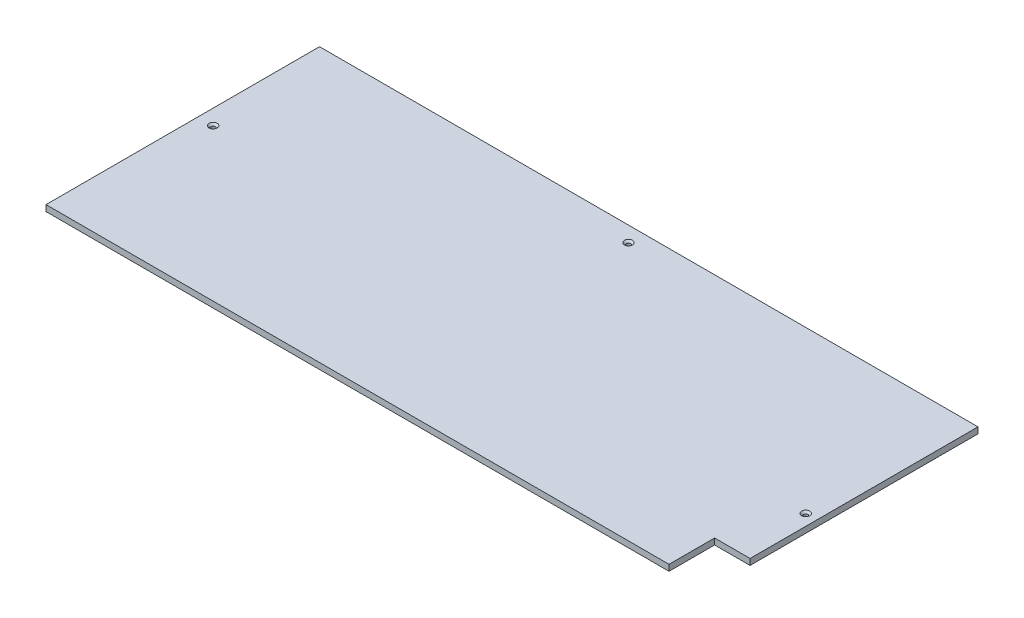
ISO-10303-21;
HEADER;
FILE_DESCRIPTION(('STEP AP214'),'2;1');
FILE_NAME('part.step','',(''),(''),'','','');
FILE_SCHEMA(('AUTOMOTIVE_DESIGN { 1 0 10303 214 1 1 1 1 }'));
ENDSEC;
DATA;
#1=APPLICATION_CONTEXT('core data for automotive mechanical design processes');
#2=APPLICATION_PROTOCOL_DEFINITION('international standard','automotive_design',2000,#1);
#3=PRODUCT_CONTEXT('',#1,'mechanical');
#4=PRODUCT('Part','Part','',(#3));
#5=PRODUCT_RELATED_PRODUCT_CATEGORY('part','',(#4));
#6=PRODUCT_DEFINITION_FORMATION('','',#4);
#7=PRODUCT_DEFINITION_CONTEXT('part definition',#1,'design');
#8=PRODUCT_DEFINITION('design','',#6,#7);
#9=PRODUCT_DEFINITION_SHAPE('','',#8);
#10=(LENGTH_UNIT() NAMED_UNIT(*) SI_UNIT(.MILLI.,.METRE.));
#11=(NAMED_UNIT(*) PLANE_ANGLE_UNIT() SI_UNIT($,.RADIAN.));
#12=(NAMED_UNIT(*) SI_UNIT($,.STERADIAN.) SOLID_ANGLE_UNIT());
#13=UNCERTAINTY_MEASURE_WITH_UNIT(LENGTH_MEASURE(1.E-05),#10,'distance_accuracy_value','');
#14=(GEOMETRIC_REPRESENTATION_CONTEXT(3) GLOBAL_UNCERTAINTY_ASSIGNED_CONTEXT((#13)) GLOBAL_UNIT_ASSIGNED_CONTEXT((#10,
#11,#12)) REPRESENTATION_CONTEXT('',''));
#15=CARTESIAN_POINT('',(0.,0.,0.));
#16=DIRECTION('',(0.,0.,1.));
#17=DIRECTION('',(1.,0.,0.));
#18=AXIS2_PLACEMENT_3D('',#15,#16,#17);
#19=CARTESIAN_POINT('',(325.,6.,150.));
#20=DIRECTION('',(0.,0.,-1.));
#21=DIRECTION('',(-1.,0.,0.));
#22=AXIS2_PLACEMENT_3D('',#19,#20,#21);
#23=PLANE('',#22);
#24=DIRECTION('',(0.,-1.,0.));
#25=VECTOR('',#24,1.);
#26=CARTESIAN_POINT('',(290.,6.,150.));
#27=LINE('',#26,#25);
#28=CARTESIAN_POINT('',(290.,6.,150.));
#29=VERTEX_POINT('',#28);
#30=CARTESIAN_POINT('',(290.,0.,150.));
#31=VERTEX_POINT('',#30);
#32=EDGE_CURVE('E117',#29,#31,#27,.T.);
#33=ORIENTED_EDGE('',*,*,#32,.F.);
#34=DIRECTION('',(1.,0.,0.));
#35=VECTOR('',#34,1.);
#36=CARTESIAN_POINT('',(325.,6.,150.));
#37=LINE('',#36,#35);
#38=CARTESIAN_POINT('',(-325.,6.,150.));
#39=VERTEX_POINT('',#38);
#40=EDGE_CURVE('E81',#39,#29,#37,.T.);
#41=ORIENTED_EDGE('',*,*,#40,.F.);
#42=DIRECTION('',(0.,-1.,0.));
#43=VECTOR('',#42,1.);
#44=CARTESIAN_POINT('',(-325.,6.,150.));
#45=LINE('',#44,#43);
#46=CARTESIAN_POINT('',(-325.,0.,150.));
#47=VERTEX_POINT('',#46);
#48=EDGE_CURVE('E138',#39,#47,#45,.T.);
#49=ORIENTED_EDGE('',*,*,#48,.T.);
#50=DIRECTION('',(1.,0.,0.));
#51=VECTOR('',#50,1.);
#52=CARTESIAN_POINT('',(325.,0.,150.));
#53=LINE('',#52,#51);
#54=EDGE_CURVE('E129',#47,#31,#53,.T.);
#55=ORIENTED_EDGE('',*,*,#54,.T.);
#56=EDGE_LOOP('',(#33,#41,#49,#55));
#57=FACE_BOUND('',#56,.T.);
#58=ADVANCED_FACE('F34',(#57),#23,.F.);
#59=CARTESIAN_POINT('',(0.,6.,0.));
#60=DIRECTION('',(0.,1.,0.));
#61=DIRECTION('',(0.,0.,1.));
#62=AXIS2_PLACEMENT_3D('',#59,#60,#61);
#63=PLANE('',#62);
#64=CARTESIAN_POINT('',(-310.,6.,0.));
#65=DIRECTION('',(0.,1.,0.));
#66=DIRECTION('',(0.,0.,1.));
#67=AXIS2_PLACEMENT_3D('',#64,#65,#66);
#68=CIRCLE('',#67,4.);
#69=CARTESIAN_POINT('',(-310.,6.,3.99999999999993));
#70=VERTEX_POINT('',#69);
#71=EDGE_CURVE('E199',#70,#70,#68,.T.);
#72=ORIENTED_EDGE('',*,*,#71,.F.);
#73=EDGE_LOOP('',(#72));
#74=FACE_BOUND('',#73,.T.);
#75=CARTESIAN_POINT('',(-5.00000000000006,6.,-105.));
#76=DIRECTION('',(0.,1.,0.));
#77=DIRECTION('',(0.,0.,1.));
#78=AXIS2_PLACEMENT_3D('',#75,#76,#77);
#79=CIRCLE('',#78,4.);
#80=CARTESIAN_POINT('',(-5.00000000000006,6.,-101.));
#81=VERTEX_POINT('',#80);
#82=EDGE_CURVE('E206',#81,#81,#79,.T.);
#83=ORIENTED_EDGE('',*,*,#82,.F.);
#84=EDGE_LOOP('',(#83));
#85=FACE_BOUND('',#84,.T.);
#86=CARTESIAN_POINT('',(314.,6.,38.9999999999999));
#87=DIRECTION('',(0.,1.,0.));
#88=DIRECTION('',(0.,0.,1.));
#89=AXIS2_PLACEMENT_3D('',#86,#87,#88);
#90=CIRCLE('',#89,4.);
#91=CARTESIAN_POINT('',(314.,6.,42.9999999999999));
#92=VERTEX_POINT('',#91);
#93=EDGE_CURVE('E215',#92,#92,#90,.T.);
#94=ORIENTED_EDGE('',*,*,#93,.F.);
#95=EDGE_LOOP('',(#94));
#96=FACE_BOUND('',#95,.T.);
#97=ORIENTED_EDGE('',*,*,#40,.T.);
#98=DIRECTION('',(0.,0.,-1.));
#99=VECTOR('',#98,1.);
#100=CARTESIAN_POINT('',(290.,6.,0.));
#101=LINE('',#100,#99);
#102=CARTESIAN_POINT('',(290.,6.,105.));
#103=VERTEX_POINT('',#102);
#104=EDGE_CURVE('E101',#29,#103,#101,.T.);
#105=ORIENTED_EDGE('',*,*,#104,.T.);
#106=DIRECTION('',(-1.,0.,0.));
#107=VECTOR('',#106,1.);
#108=CARTESIAN_POINT('',(0.,6.,105.));
#109=LINE('',#108,#107);
#110=CARTESIAN_POINT('',(325.,6.,105.));
#111=VERTEX_POINT('',#110);
#112=EDGE_CURVE('E95',#111,#103,#109,.T.);
#113=ORIENTED_EDGE('',*,*,#112,.F.);
#114=DIRECTION('',(0.,0.,-1.));
#115=VECTOR('',#114,1.);
#116=CARTESIAN_POINT('',(325.,6.,150.));
#117=LINE('',#116,#115);
#118=CARTESIAN_POINT('',(325.,6.,-120.));
#119=VERTEX_POINT('',#118);
#120=EDGE_CURVE('E123',#111,#119,#117,.T.);
#121=ORIENTED_EDGE('',*,*,#120,.T.);
#122=DIRECTION('',(-1.,0.,0.));
#123=VECTOR('',#122,1.);
#124=CARTESIAN_POINT('',(325.,6.,-120.));
#125=LINE('',#124,#123);
#126=CARTESIAN_POINT('',(-325.,6.,-120.));
#127=VERTEX_POINT('',#126);
#128=EDGE_CURVE('E57',#119,#127,#125,.T.);
#129=ORIENTED_EDGE('',*,*,#128,.T.);
#130=DIRECTION('',(0.,0.,1.));
#131=VECTOR('',#130,1.);
#132=CARTESIAN_POINT('',(-325.,6.,150.));
#133=LINE('',#132,#131);
#134=EDGE_CURVE('E120',#127,#39,#133,.T.);
#135=ORIENTED_EDGE('',*,*,#134,.T.);
#136=EDGE_LOOP('',(#97,#105,#113,#121,#129,#135));
#137=FACE_BOUND('',#136,.T.);
#138=ADVANCED_FACE('F108',(#74,#85,#96,#137),#63,.T.);
#139=CARTESIAN_POINT('',(0.,0.,0.));
#140=DIRECTION('',(0.,1.,0.));
#141=DIRECTION('',(0.,0.,1.));
#142=AXIS2_PLACEMENT_3D('',#139,#140,#141);
#143=PLANE('',#142);
#144=CARTESIAN_POINT('',(-310.,0.,0.));
#145=DIRECTION('',(0.,1.,0.));
#146=DIRECTION('',(0.,0.,1.));
#147=AXIS2_PLACEMENT_3D('',#144,#145,#146);
#148=CIRCLE('',#147,2.09999999999999);
#149=CARTESIAN_POINT('',(-310.,0.,2.09999999999992));
#150=VERTEX_POINT('',#149);
#151=EDGE_CURVE('E201',#150,#150,#148,.T.);
#152=ORIENTED_EDGE('',*,*,#151,.T.);
#153=EDGE_LOOP('',(#152));
#154=FACE_BOUND('',#153,.T.);
#155=CARTESIAN_POINT('',(-5.00000000000006,0.,-105.));
#156=DIRECTION('',(0.,1.,0.));
#157=DIRECTION('',(0.,0.,1.));
#158=AXIS2_PLACEMENT_3D('',#155,#156,#157);
#159=CIRCLE('',#158,2.1);
#160=CARTESIAN_POINT('',(-5.00000000000006,0.,-102.9));
#161=VERTEX_POINT('',#160);
#162=EDGE_CURVE('E212',#161,#161,#159,.T.);
#163=ORIENTED_EDGE('',*,*,#162,.T.);
#164=EDGE_LOOP('',(#163));
#165=FACE_BOUND('',#164,.T.);
#166=CARTESIAN_POINT('',(314.,0.,38.9999999999999));
#167=DIRECTION('',(0.,1.,0.));
#168=DIRECTION('',(0.,0.,1.));
#169=AXIS2_PLACEMENT_3D('',#166,#167,#168);
#170=CIRCLE('',#169,2.09999999999999);
#171=CARTESIAN_POINT('',(314.,0.,41.0999999999999));
#172=VERTEX_POINT('',#171);
#173=EDGE_CURVE('E109',#172,#172,#170,.T.);
#174=ORIENTED_EDGE('',*,*,#173,.T.);
#175=EDGE_LOOP('',(#174));
#176=FACE_BOUND('',#175,.T.);
#177=DIRECTION('',(0.,0.,-1.));
#178=VECTOR('',#177,1.);
#179=CARTESIAN_POINT('',(290.,0.,0.));
#180=LINE('',#179,#178);
#181=CARTESIAN_POINT('',(290.,0.,105.));
#182=VERTEX_POINT('',#181);
#183=EDGE_CURVE('E11',#31,#182,#180,.T.);
#184=ORIENTED_EDGE('',*,*,#183,.F.);
#185=ORIENTED_EDGE('',*,*,#54,.F.);
#186=DIRECTION('',(0.,0.,1.));
#187=VECTOR('',#186,1.);
#188=CARTESIAN_POINT('',(-325.,0.,150.));
#189=LINE('',#188,#187);
#190=CARTESIAN_POINT('',(-325.,0.,-120.));
#191=VERTEX_POINT('',#190);
#192=EDGE_CURVE('E119',#191,#47,#189,.T.);
#193=ORIENTED_EDGE('',*,*,#192,.F.);
#194=DIRECTION('',(-1.,0.,0.));
#195=VECTOR('',#194,1.);
#196=CARTESIAN_POINT('',(325.,0.,-120.));
#197=LINE('',#196,#195);
#198=CARTESIAN_POINT('',(325.,0.,-120.));
#199=VERTEX_POINT('',#198);
#200=EDGE_CURVE('E74',#199,#191,#197,.T.);
#201=ORIENTED_EDGE('',*,*,#200,.F.);
#202=DIRECTION('',(0.,0.,-1.));
#203=VECTOR('',#202,1.);
#204=CARTESIAN_POINT('',(325.,0.,150.));
#205=LINE('',#204,#203);
#206=CARTESIAN_POINT('',(325.,0.,105.));
#207=VERTEX_POINT('',#206);
#208=EDGE_CURVE('E132',#207,#199,#205,.T.);
#209=ORIENTED_EDGE('',*,*,#208,.F.);
#210=DIRECTION('',(-1.,0.,0.));
#211=VECTOR('',#210,1.);
#212=CARTESIAN_POINT('',(0.,0.,105.));
#213=LINE('',#212,#211);
#214=EDGE_CURVE('E42',#207,#182,#213,.T.);
#215=ORIENTED_EDGE('',*,*,#214,.T.);
#216=EDGE_LOOP('',(#184,#185,#193,#201,#209,#215));
#217=FACE_BOUND('',#216,.T.);
#218=ADVANCED_FACE('F141',(#154,#165,#176,#217),#143,.F.);
#219=CARTESIAN_POINT('',(-325.,6.,150.));
#220=DIRECTION('',(1.,0.,0.));
#221=DIRECTION('',(0.,0.,-1.));
#222=AXIS2_PLACEMENT_3D('',#219,#220,#221);
#223=PLANE('',#222);
#224=ORIENTED_EDGE('',*,*,#192,.T.);
#225=ORIENTED_EDGE('',*,*,#48,.F.);
#226=ORIENTED_EDGE('',*,*,#134,.F.);
#227=DIRECTION('',(0.,-1.,0.));
#228=VECTOR('',#227,1.);
#229=CARTESIAN_POINT('',(-325.,6.,-120.));
#230=LINE('',#229,#228);
#231=EDGE_CURVE('E126',#127,#191,#230,.T.);
#232=ORIENTED_EDGE('',*,*,#231,.T.);
#233=EDGE_LOOP('',(#224,#225,#226,#232));
#234=FACE_BOUND('',#233,.T.);
#235=ADVANCED_FACE('F36',(#234),#223,.F.);
#236=CARTESIAN_POINT('',(325.,6.,150.));
#237=DIRECTION('',(-1.,0.,0.));
#238=DIRECTION('',(0.,0.,1.));
#239=AXIS2_PLACEMENT_3D('',#236,#237,#238);
#240=PLANE('',#239);
#241=ORIENTED_EDGE('',*,*,#120,.F.);
#242=DIRECTION('',(0.,-1.,0.));
#243=VECTOR('',#242,1.);
#244=CARTESIAN_POINT('',(325.,6.,105.));
#245=LINE('',#244,#243);
#246=EDGE_CURVE('E98',#111,#207,#245,.T.);
#247=ORIENTED_EDGE('',*,*,#246,.T.);
#248=ORIENTED_EDGE('',*,*,#208,.T.);
#249=DIRECTION('',(0.,-1.,0.));
#250=VECTOR('',#249,1.);
#251=CARTESIAN_POINT('',(325.,6.,-120.));
#252=LINE('',#251,#250);
#253=EDGE_CURVE('E136',#119,#199,#252,.T.);
#254=ORIENTED_EDGE('',*,*,#253,.F.);
#255=EDGE_LOOP('',(#241,#247,#248,#254));
#256=FACE_BOUND('',#255,.T.);
#257=ADVANCED_FACE('F143',(#256),#240,.F.);
#258=CARTESIAN_POINT('',(325.,6.,-120.));
#259=DIRECTION('',(0.,0.,1.));
#260=DIRECTION('',(1.,0.,0.));
#261=AXIS2_PLACEMENT_3D('',#258,#259,#260);
#262=PLANE('',#261);
#263=ORIENTED_EDGE('',*,*,#200,.T.);
#264=ORIENTED_EDGE('',*,*,#231,.F.);
#265=ORIENTED_EDGE('',*,*,#128,.F.);
#266=ORIENTED_EDGE('',*,*,#253,.T.);
#267=EDGE_LOOP('',(#263,#264,#265,#266));
#268=FACE_BOUND('',#267,.T.);
#269=ADVANCED_FACE('F145',(#268),#262,.F.);
#270=CARTESIAN_POINT('',(290.,0.,0.));
#271=DIRECTION('',(1.,0.,0.));
#272=DIRECTION('',(0.,0.,-1.));
#273=AXIS2_PLACEMENT_3D('',#270,#271,#272);
#274=PLANE('',#273);
#275=ORIENTED_EDGE('',*,*,#32,.T.);
#276=ORIENTED_EDGE('',*,*,#183,.T.);
#277=DIRECTION('',(0.,1.,0.));
#278=VECTOR('',#277,1.);
#279=CARTESIAN_POINT('',(290.,0.,105.));
#280=LINE('',#279,#278);
#281=EDGE_CURVE('E49',#182,#103,#280,.T.);
#282=ORIENTED_EDGE('',*,*,#281,.T.);
#283=ORIENTED_EDGE('',*,*,#104,.F.);
#284=EDGE_LOOP('',(#275,#276,#282,#283));
#285=FACE_BOUND('',#284,.T.);
#286=ADVANCED_FACE('F104',(#285),#274,.T.);
#287=CARTESIAN_POINT('',(0.,0.,105.));
#288=DIRECTION('',(0.,0.,-1.));
#289=DIRECTION('',(-1.,0.,0.));
#290=AXIS2_PLACEMENT_3D('',#287,#288,#289);
#291=PLANE('',#290);
#292=ORIENTED_EDGE('',*,*,#112,.T.);
#293=ORIENTED_EDGE('',*,*,#281,.F.);
#294=ORIENTED_EDGE('',*,*,#214,.F.);
#295=ORIENTED_EDGE('',*,*,#246,.F.);
#296=EDGE_LOOP('',(#292,#293,#294,#295));
#297=FACE_BOUND('',#296,.T.);
#298=ADVANCED_FACE('F96',(#297),#291,.F.);
#299=CARTESIAN_POINT('',(314.,6.,38.9999999999999));
#300=DIRECTION('',(0.,1.,0.));
#301=DIRECTION('',(0.,0.,1.));
#302=AXIS2_PLACEMENT_3D('',#299,#300,#301);
#303=CYLINDRICAL_SURFACE('',#302,2.09999999999999);
#304=ORIENTED_EDGE('',*,*,#173,.F.);
#305=EDGE_LOOP('',(#304));
#306=FACE_BOUND('',#305,.T.);
#307=CARTESIAN_POINT('',(314.,4.1,38.9999999999999));
#308=DIRECTION('',(0.,1.,0.));
#309=DIRECTION('',(0.,0.,1.));
#310=AXIS2_PLACEMENT_3D('',#307,#308,#309);
#311=CIRCLE('',#310,2.09999999999999);
#312=CARTESIAN_POINT('',(314.,4.1,41.0999999999999));
#313=VERTEX_POINT('',#312);
#314=EDGE_CURVE('E112',#313,#313,#311,.T.);
#315=ORIENTED_EDGE('',*,*,#314,.T.);
#316=EDGE_LOOP('',(#315));
#317=FACE_BOUND('',#316,.T.);
#318=ADVANCED_FACE('F168',(#306,#317),#303,.F.);
#319=CARTESIAN_POINT('',(314.,6.,38.9999999999999));
#320=DIRECTION('',(0.,1.,0.));
#321=DIRECTION('',(0.,0.,1.));
#322=AXIS2_PLACEMENT_3D('',#319,#320,#321);
#323=CONICAL_SURFACE('',#322,4.,0.785398163397452);
#324=ORIENTED_EDGE('',*,*,#314,.F.);
#325=EDGE_LOOP('',(#324));
#326=FACE_BOUND('',#325,.T.);
#327=ORIENTED_EDGE('',*,*,#93,.T.);
#328=EDGE_LOOP('',(#327));
#329=FACE_BOUND('',#328,.T.);
#330=ADVANCED_FACE('F171',(#326,#329),#323,.F.);
#331=CARTESIAN_POINT('',(-5.00000000000006,6.,-105.));
#332=DIRECTION('',(0.,1.,0.));
#333=DIRECTION('',(0.,0.,1.));
#334=AXIS2_PLACEMENT_3D('',#331,#332,#333);
#335=CYLINDRICAL_SURFACE('',#334,2.1);
#336=ORIENTED_EDGE('',*,*,#162,.F.);
#337=EDGE_LOOP('',(#336));
#338=FACE_BOUND('',#337,.T.);
#339=CARTESIAN_POINT('',(-5.00000000000006,4.1,-105.));
#340=DIRECTION('',(0.,1.,0.));
#341=DIRECTION('',(0.,0.,1.));
#342=AXIS2_PLACEMENT_3D('',#339,#340,#341);
#343=CIRCLE('',#342,2.1);
#344=CARTESIAN_POINT('',(-5.00000000000006,4.1,-102.9));
#345=VERTEX_POINT('',#344);
#346=EDGE_CURVE('E209',#345,#345,#343,.T.);
#347=ORIENTED_EDGE('',*,*,#346,.T.);
#348=EDGE_LOOP('',(#347));
#349=FACE_BOUND('',#348,.T.);
#350=ADVANCED_FACE('F175',(#338,#349),#335,.F.);
#351=CARTESIAN_POINT('',(-5.00000000000006,6.,-105.));
#352=DIRECTION('',(0.,1.,0.));
#353=DIRECTION('',(0.,0.,1.));
#354=AXIS2_PLACEMENT_3D('',#351,#352,#353);
#355=CONICAL_SURFACE('',#354,4.,0.785398163397449);
#356=ORIENTED_EDGE('',*,*,#346,.F.);
#357=EDGE_LOOP('',(#356));
#358=FACE_BOUND('',#357,.T.);
#359=ORIENTED_EDGE('',*,*,#82,.T.);
#360=EDGE_LOOP('',(#359));
#361=FACE_BOUND('',#360,.T.);
#362=ADVANCED_FACE('F179',(#358,#361),#355,.F.);
#363=CARTESIAN_POINT('',(-310.,6.,0.));
#364=DIRECTION('',(0.,1.,0.));
#365=DIRECTION('',(0.,0.,1.));
#366=AXIS2_PLACEMENT_3D('',#363,#364,#365);
#367=CYLINDRICAL_SURFACE('',#366,2.09999999999999);
#368=ORIENTED_EDGE('',*,*,#151,.F.);
#369=EDGE_LOOP('',(#368));
#370=FACE_BOUND('',#369,.T.);
#371=CARTESIAN_POINT('',(-310.,4.1,0.));
#372=DIRECTION('',(0.,1.,0.));
#373=DIRECTION('',(0.,0.,1.));
#374=AXIS2_PLACEMENT_3D('',#371,#372,#373);
#375=CIRCLE('',#374,2.09999999999999);
#376=CARTESIAN_POINT('',(-310.,4.1,2.09999999999992));
#377=VERTEX_POINT('',#376);
#378=EDGE_CURVE('E196',#377,#377,#375,.T.);
#379=ORIENTED_EDGE('',*,*,#378,.T.);
#380=EDGE_LOOP('',(#379));
#381=FACE_BOUND('',#380,.T.);
#382=ADVANCED_FACE('F183',(#370,#381),#367,.F.);
#383=CARTESIAN_POINT('',(-310.,6.,0.));
#384=DIRECTION('',(0.,1.,0.));
#385=DIRECTION('',(0.,0.,1.));
#386=AXIS2_PLACEMENT_3D('',#383,#384,#385);
#387=CONICAL_SURFACE('',#386,4.,0.785398163397452);
#388=ORIENTED_EDGE('',*,*,#378,.F.);
#389=EDGE_LOOP('',(#388));
#390=FACE_BOUND('',#389,.T.);
#391=ORIENTED_EDGE('',*,*,#71,.T.);
#392=EDGE_LOOP('',(#391));
#393=FACE_BOUND('',#392,.T.);
#394=ADVANCED_FACE('F187',(#390,#393),#387,.F.);
#395=CLOSED_SHELL('',(#58,#138,#218,#235,#257,#269,#286,#298,#318,#330,#350,#362,#382,#394));
#396=MANIFOLD_SOLID_BREP('B2',#395);
#397=ADVANCED_BREP_SHAPE_REPRESENTATION('',(#18,#396),#14);
#398=SHAPE_DEFINITION_REPRESENTATION(#9,#397);
ENDSEC;
END-ISO-10303-21;
